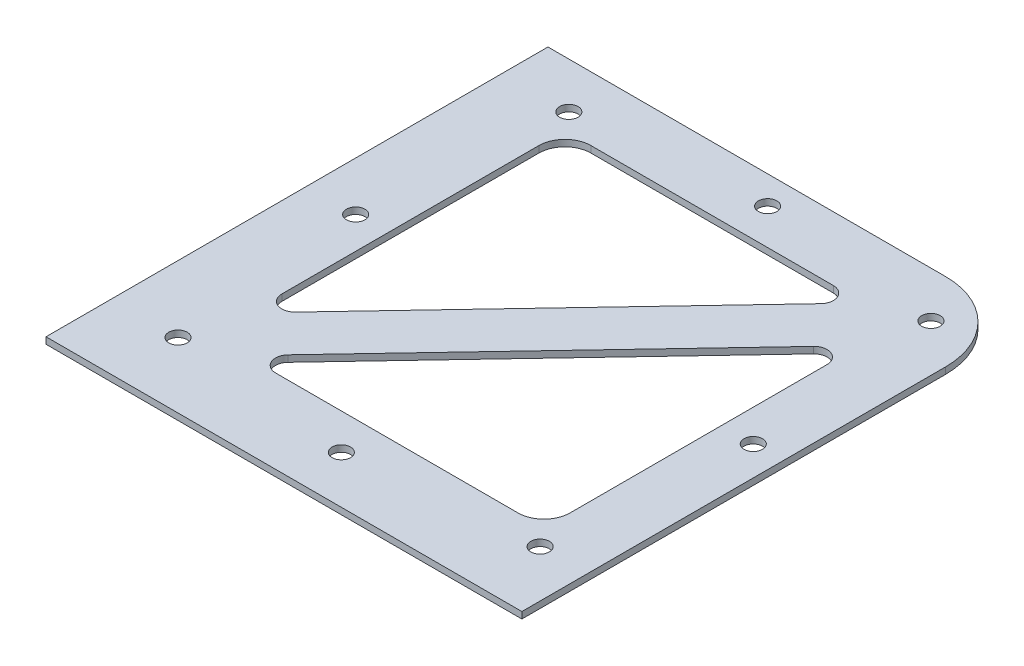
ISO-10303-21;
HEADER;
FILE_DESCRIPTION(('STEP AP214'),'2;1');
FILE_NAME('part.step','',(''),(''),'','','');
FILE_SCHEMA(('AUTOMOTIVE_DESIGN { 1 0 10303 214 1 1 1 1 }'));
ENDSEC;
DATA;
#1=APPLICATION_CONTEXT('core data for automotive mechanical design processes');
#2=APPLICATION_PROTOCOL_DEFINITION('international standard','automotive_design',2000,#1);
#3=PRODUCT_CONTEXT('',#1,'mechanical');
#4=PRODUCT('Part','Part','',(#3));
#5=PRODUCT_RELATED_PRODUCT_CATEGORY('part','',(#4));
#6=PRODUCT_DEFINITION_FORMATION('','',#4);
#7=PRODUCT_DEFINITION_CONTEXT('part definition',#1,'design');
#8=PRODUCT_DEFINITION('design','',#6,#7);
#9=PRODUCT_DEFINITION_SHAPE('','',#8);
#10=(LENGTH_UNIT() NAMED_UNIT(*) SI_UNIT(.MILLI.,.METRE.));
#11=(NAMED_UNIT(*) PLANE_ANGLE_UNIT() SI_UNIT($,.RADIAN.));
#12=(NAMED_UNIT(*) SI_UNIT($,.STERADIAN.) SOLID_ANGLE_UNIT());
#13=UNCERTAINTY_MEASURE_WITH_UNIT(LENGTH_MEASURE(1.E-05),#10,'distance_accuracy_value','');
#14=(GEOMETRIC_REPRESENTATION_CONTEXT(3) GLOBAL_UNCERTAINTY_ASSIGNED_CONTEXT((#13)) GLOBAL_UNIT_ASSIGNED_CONTEXT((#10,
#11,#12)) REPRESENTATION_CONTEXT('',''));
#15=CARTESIAN_POINT('',(0.,0.,0.));
#16=DIRECTION('',(0.,0.,1.));
#17=DIRECTION('',(1.,0.,0.));
#18=AXIS2_PLACEMENT_3D('',#15,#16,#17);
#19=CARTESIAN_POINT('',(-37.4939982606286,1.5875,0.));
#20=DIRECTION('',(1.,0.,0.));
#21=DIRECTION('',(0.,0.,-1.));
#22=AXIS2_PLACEMENT_3D('',#19,#20,#21);
#23=PLANE('',#22);
#24=DIRECTION('',(0.,0.,1.));
#25=VECTOR('',#24,1.);
#26=CARTESIAN_POINT('',(-37.4939982606286,0.,0.));
#27=LINE('',#26,#25);
#28=CARTESIAN_POINT('',(-37.4939982606286,0.,-156.662710111557));
#29=VERTEX_POINT('',#28);
#30=CARTESIAN_POINT('',(-37.4939982606286,0.,-53.4752101115565));
#31=VERTEX_POINT('',#30);
#32=EDGE_CURVE('E211',#29,#31,#27,.T.);
#33=ORIENTED_EDGE('',*,*,#32,.F.);
#34=DIRECTION('',(0.,-1.,0.));
#35=VECTOR('',#34,1.);
#36=CARTESIAN_POINT('',(-37.4939982606286,1.5875,-156.662710111557));
#37=LINE('',#36,#35);
#38=CARTESIAN_POINT('',(-37.4939982606286,1.5875,-156.662710111557));
#39=VERTEX_POINT('',#38);
#40=EDGE_CURVE('E226',#29,#39,#37,.F.);
#41=ORIENTED_EDGE('',*,*,#40,.T.);
#42=DIRECTION('',(0.,0.,1.));
#43=VECTOR('',#42,1.);
#44=CARTESIAN_POINT('',(-37.4939982606286,1.5875,0.));
#45=LINE('',#44,#43);
#46=CARTESIAN_POINT('',(-37.4939982606286,1.5875,-53.4752101115565));
#47=VERTEX_POINT('',#46);
#48=EDGE_CURVE('E188',#39,#47,#45,.T.);
#49=ORIENTED_EDGE('',*,*,#48,.T.);
#50=DIRECTION('',(0.,-1.,0.));
#51=VECTOR('',#50,1.);
#52=CARTESIAN_POINT('',(-37.4939982606286,1.5875,-53.4752101115565));
#53=LINE('',#52,#51);
#54=EDGE_CURVE('E195',#47,#31,#53,.T.);
#55=ORIENTED_EDGE('',*,*,#54,.T.);
#56=EDGE_LOOP('',(#33,#41,#49,#55));
#57=FACE_BOUND('',#56,.T.);
#58=ADVANCED_FACE('F41',(#57),#23,.T.);
#59=CARTESIAN_POINT('',(0.,1.5875,-175.712710111557));
#60=DIRECTION('',(0.,0.,-1.));
#61=DIRECTION('',(-1.,0.,0.));
#62=AXIS2_PLACEMENT_3D('',#59,#60,#61);
#63=PLANE('',#62);
#64=DIRECTION('',(1.,0.,0.));
#65=VECTOR('',#64,1.);
#66=CARTESIAN_POINT('',(0.,1.5875,-175.712710111557));
#67=LINE('',#66,#65);
#68=CARTESIAN_POINT('',(-153.381498260629,1.5875,-175.712710111557));
#69=VERTEX_POINT('',#68);
#70=CARTESIAN_POINT('',(-56.5439982606286,1.5875,-175.712710111557));
#71=VERTEX_POINT('',#70);
#72=EDGE_CURVE('E165',#69,#71,#67,.T.);
#73=ORIENTED_EDGE('',*,*,#72,.T.);
#74=DIRECTION('',(0.,-1.,0.));
#75=VECTOR('',#74,1.);
#76=CARTESIAN_POINT('',(-56.5439982606286,1.5875,-175.712710111557));
#77=LINE('',#76,#75);
#78=CARTESIAN_POINT('',(-56.5439982606286,0.,-175.712710111557));
#79=VERTEX_POINT('',#78);
#80=EDGE_CURVE('E172',#71,#79,#77,.T.);
#81=ORIENTED_EDGE('',*,*,#80,.T.);
#82=DIRECTION('',(1.,0.,0.));
#83=VECTOR('',#82,1.);
#84=CARTESIAN_POINT('',(0.,0.,-175.712710111557));
#85=LINE('',#84,#83);
#86=CARTESIAN_POINT('',(-153.381498260629,0.,-175.712710111557));
#87=VERTEX_POINT('',#86);
#88=EDGE_CURVE('E168',#87,#79,#85,.T.);
#89=ORIENTED_EDGE('',*,*,#88,.F.);
#90=DIRECTION('',(0.,-1.,0.));
#91=VECTOR('',#90,1.);
#92=CARTESIAN_POINT('',(-153.381498260629,1.5875,-175.712710111557));
#93=LINE('',#92,#91);
#94=EDGE_CURVE('E160',#69,#87,#93,.T.);
#95=ORIENTED_EDGE('',*,*,#94,.F.);
#96=EDGE_LOOP('',(#73,#81,#89,#95));
#97=FACE_BOUND('',#96,.T.);
#98=ADVANCED_FACE('F162',(#97),#63,.T.);
#99=CARTESIAN_POINT('',(-153.381498260629,1.5875,0.));
#100=DIRECTION('',(1.,0.,0.));
#101=DIRECTION('',(0.,0.,-1.));
#102=AXIS2_PLACEMENT_3D('',#99,#100,#101);
#103=PLANE('',#102);
#104=DIRECTION('',(0.,0.,1.));
#105=VECTOR('',#104,1.);
#106=CARTESIAN_POINT('',(-153.381498260629,0.,0.));
#107=LINE('',#106,#105);
#108=CARTESIAN_POINT('',(-153.381498260629,0.,-53.4752101115565));
#109=VERTEX_POINT('',#108);
#110=EDGE_CURVE('E214',#87,#109,#107,.T.);
#111=ORIENTED_EDGE('',*,*,#110,.T.);
#112=DIRECTION('',(0.,-1.,0.));
#113=VECTOR('',#112,1.);
#114=CARTESIAN_POINT('',(-153.381498260629,1.5875,-53.4752101115565));
#115=LINE('',#114,#113);
#116=CARTESIAN_POINT('',(-153.381498260629,1.5875,-53.4752101115565));
#117=VERTEX_POINT('',#116);
#118=EDGE_CURVE('E173',#117,#109,#115,.T.);
#119=ORIENTED_EDGE('',*,*,#118,.F.);
#120=DIRECTION('',(0.,0.,1.));
#121=VECTOR('',#120,1.);
#122=CARTESIAN_POINT('',(-153.381498260629,1.5875,0.));
#123=LINE('',#122,#121);
#124=EDGE_CURVE('E177',#69,#117,#123,.T.);
#125=ORIENTED_EDGE('',*,*,#124,.F.);
#126=ORIENTED_EDGE('',*,*,#94,.T.);
#127=EDGE_LOOP('',(#111,#119,#125,#126));
#128=FACE_BOUND('',#127,.T.);
#129=ADVANCED_FACE('F178',(#128),#103,.F.);
#130=CARTESIAN_POINT('',(0.,1.5875,-160.155210111557));
#131=DIRECTION('',(0.,0.,-1.));
#132=DIRECTION('',(-1.,0.,0.));
#133=AXIS2_PLACEMENT_3D('',#130,#131,#132);
#134=PLANE('',#133);
#135=DIRECTION('',(1.,0.,0.));
#136=VECTOR('',#135,1.);
#137=CARTESIAN_POINT('',(0.,0.,-160.155210111557));
#138=LINE('',#137,#136);
#139=CARTESIAN_POINT('',(-127.346498260629,0.,-160.155210111557));
#140=VERTEX_POINT('',#139);
#141=CARTESIAN_POINT('',(-68.3253059128234,0.,-160.155210111557));
#142=VERTEX_POINT('',#141);
#143=EDGE_CURVE('E204',#140,#142,#138,.T.);
#144=ORIENTED_EDGE('',*,*,#143,.T.);
#145=DIRECTION('',(0.,-1.,0.));
#146=VECTOR('',#145,1.);
#147=CARTESIAN_POINT('',(-68.3253059128234,1.5875,-160.155210111557));
#148=LINE('',#147,#146);
#149=CARTESIAN_POINT('',(-68.3253059128234,1.5875,-160.155210111557));
#150=VERTEX_POINT('',#149);
#151=EDGE_CURVE('E62',#142,#150,#148,.F.);
#152=ORIENTED_EDGE('',*,*,#151,.T.);
#153=DIRECTION('',(1.,0.,0.));
#154=VECTOR('',#153,1.);
#155=CARTESIAN_POINT('',(0.,1.5875,-160.155210111557));
#156=LINE('',#155,#154);
#157=CARTESIAN_POINT('',(-127.346498260629,1.5875,-160.155210111557));
#158=VERTEX_POINT('',#157);
#159=EDGE_CURVE('E304',#158,#150,#156,.T.);
#160=ORIENTED_EDGE('',*,*,#159,.F.);
#161=DIRECTION('',(0.,-1.,0.));
#162=VECTOR('',#161,1.);
#163=CARTESIAN_POINT('',(-127.346498260629,1.5875,-160.155210111557));
#164=LINE('',#163,#162);
#165=EDGE_CURVE('E235',#158,#140,#164,.T.);
#166=ORIENTED_EDGE('',*,*,#165,.T.);
#167=EDGE_LOOP('',(#144,#152,#160,#166));
#168=FACE_BOUND('',#167,.T.);
#169=ADVANCED_FACE('F434',(#168),#134,.F.);
#170=CARTESIAN_POINT('',(-112.12164931785,1.5875,-106.061019624993));
#171=DIRECTION('',(-0.726468416954716,0.,-0.687199853876083));
#172=DIRECTION('',(-0.687199853876083,0.,0.726468416954716));
#173=AXIS2_PLACEMENT_3D('',#170,#171,#172);
#174=PLANE('',#173);
#175=DIRECTION('',(0.687199853876083,0.,-0.726468416954716));
#176=VECTOR('',#175,1.);
#177=CARTESIAN_POINT('',(-112.12164931785,0.,-106.061019624993));
#178=LINE('',#177,#176);
#179=CARTESIAN_POINT('',(-128.214961036797,0.,-89.0480900935344));
#180=VERTEX_POINT('',#179);
#181=CARTESIAN_POINT('',(-66.0187686889921,0.,-154.7983505755));
#182=VERTEX_POINT('',#181);
#183=EDGE_CURVE('E206',#180,#182,#178,.T.);
#184=ORIENTED_EDGE('',*,*,#183,.F.);
#185=DIRECTION('',(0.,-1.,0.));
#186=VECTOR('',#185,1.);
#187=CARTESIAN_POINT('',(-128.214961036797,1.5875,-89.0480900935344));
#188=LINE('',#187,#186);
#189=CARTESIAN_POINT('',(-128.214961036797,1.5875,-89.0480900935344));
#190=VERTEX_POINT('',#189);
#191=EDGE_CURVE('E266',#180,#190,#188,.F.);
#192=ORIENTED_EDGE('',*,*,#191,.T.);
#193=DIRECTION('',(0.687199853876083,0.,-0.726468416954716));
#194=VECTOR('',#193,1.);
#195=CARTESIAN_POINT('',(-112.12164931785,1.5875,-106.061019624993));
#196=LINE('',#195,#194);
#197=CARTESIAN_POINT('',(-66.0187686889921,1.5875,-154.7983505755));
#198=VERTEX_POINT('',#197);
#199=EDGE_CURVE('E287',#190,#198,#196,.T.);
#200=ORIENTED_EDGE('',*,*,#199,.T.);
#201=DIRECTION('',(0.,-1.,0.));
#202=VECTOR('',#201,1.);
#203=CARTESIAN_POINT('',(-66.0187686889921,1.5875,-154.7983505755));
#204=LINE('',#203,#202);
#205=EDGE_CURVE('E263',#198,#182,#204,.T.);
#206=ORIENTED_EDGE('',*,*,#205,.T.);
#207=EDGE_LOOP('',(#184,#192,#200,#206));
#208=FACE_BOUND('',#207,.T.);
#209=ADVANCED_FACE('F300',(#208),#174,.T.);
#210=CARTESIAN_POINT('',(-102.895500422525,1.5875,-97.3335814807669));
#211=DIRECTION('',(-0.726468416954716,0.,-0.687199853876083));
#212=DIRECTION('',(-0.687199853876083,0.,0.726468416954716));
#213=AXIS2_PLACEMENT_3D('',#210,#211,#212);
#214=PLANE('',#213);
#215=DIRECTION('',(0.687199853876083,0.,-0.726468416954716));
#216=VECTOR('',#215,1.);
#217=CARTESIAN_POINT('',(-102.895500422525,0.,-97.3335814807669));
#218=LINE('',#217,#216);
#219=CARTESIAN_POINT('',(-120.094227832265,0.,-79.1520696476131));
#220=VERTEX_POINT('',#219);
#221=CARTESIAN_POINT('',(-57.8980354844598,0.,-144.902330129579));
#222=VERTEX_POINT('',#221);
#223=EDGE_CURVE('E196',#220,#222,#218,.T.);
#224=ORIENTED_EDGE('',*,*,#223,.T.);
#225=DIRECTION('',(0.,-1.,0.));
#226=VECTOR('',#225,1.);
#227=CARTESIAN_POINT('',(-57.8980354844598,1.5875,-144.902330129579));
#228=LINE('',#227,#226);
#229=CARTESIAN_POINT('',(-57.8980354844598,1.5875,-144.902330129579));
#230=VERTEX_POINT('',#229);
#231=EDGE_CURVE('E256',#222,#230,#228,.F.);
#232=ORIENTED_EDGE('',*,*,#231,.T.);
#233=DIRECTION('',(0.687199853876083,0.,-0.726468416954716));
#234=VECTOR('',#233,1.);
#235=CARTESIAN_POINT('',(-102.895500422525,1.5875,-97.3335814807669));
#236=LINE('',#235,#234);
#237=CARTESIAN_POINT('',(-120.094227832265,1.5875,-79.1520696476131));
#238=VERTEX_POINT('',#237);
#239=EDGE_CURVE('E219',#238,#230,#236,.T.);
#240=ORIENTED_EDGE('',*,*,#239,.F.);
#241=DIRECTION('',(0.,-1.,0.));
#242=VECTOR('',#241,1.);
#243=CARTESIAN_POINT('',(-120.094227832265,1.5875,-79.1520696476131));
#244=LINE('',#243,#242);
#245=EDGE_CURVE('E253',#238,#220,#244,.T.);
#246=ORIENTED_EDGE('',*,*,#245,.T.);
#247=EDGE_LOOP('',(#224,#232,#240,#246));
#248=FACE_BOUND('',#247,.T.);
#249=ADVANCED_FACE('F395',(#248),#214,.F.);
#250=CARTESIAN_POINT('',(-52.4164982606285,1.5875,0.));
#251=DIRECTION('',(1.,0.,0.));
#252=DIRECTION('',(0.,0.,-1.));
#253=AXIS2_PLACEMENT_3D('',#250,#251,#252);
#254=PLANE('',#253);
#255=DIRECTION('',(0.,0.,1.));
#256=VECTOR('',#255,1.);
#257=CARTESIAN_POINT('',(-52.4164982606285,1.5875,0.));
#258=LINE('',#257,#256);
#259=CARTESIAN_POINT('',(-52.4164982606286,1.5875,-142.720470593522));
#260=VERTEX_POINT('',#259);
#261=CARTESIAN_POINT('',(-52.4164982606286,1.5875,-80.1452101115566));
#262=VERTEX_POINT('',#261);
#263=EDGE_CURVE('E309',#260,#262,#258,.T.);
#264=ORIENTED_EDGE('',*,*,#263,.F.);
#265=DIRECTION('',(0.,-1.,0.));
#266=VECTOR('',#265,1.);
#267=CARTESIAN_POINT('',(-52.4164982606286,0.,-142.720470593522));
#268=LINE('',#267,#266);
#269=CARTESIAN_POINT('',(-52.4164982606286,0.,-142.720470593522));
#270=VERTEX_POINT('',#269);
#271=EDGE_CURVE('E250',#260,#270,#268,.T.);
#272=ORIENTED_EDGE('',*,*,#271,.T.);
#273=DIRECTION('',(0.,0.,1.));
#274=VECTOR('',#273,1.);
#275=CARTESIAN_POINT('',(-52.4164982606285,0.,0.));
#276=LINE('',#275,#274);
#277=CARTESIAN_POINT('',(-52.4164982606286,0.,-80.1452101115566));
#278=VERTEX_POINT('',#277);
#279=EDGE_CURVE('E199',#270,#278,#276,.T.);
#280=ORIENTED_EDGE('',*,*,#279,.T.);
#281=DIRECTION('',(0.,-1.,0.));
#282=VECTOR('',#281,1.);
#283=CARTESIAN_POINT('',(-52.4164982606286,1.5875,-80.1452101115566));
#284=LINE('',#283,#282);
#285=EDGE_CURVE('E232',#278,#262,#284,.F.);
#286=ORIENTED_EDGE('',*,*,#285,.T.);
#287=EDGE_LOOP('',(#264,#272,#280,#286));
#288=FACE_BOUND('',#287,.T.);
#289=ADVANCED_FACE('F406',(#288),#254,.F.);
#290=CARTESIAN_POINT('',(-133.696498260629,1.5875,0.));
#291=DIRECTION('',(1.,0.,0.));
#292=DIRECTION('',(0.,0.,-1.));
#293=AXIS2_PLACEMENT_3D('',#290,#291,#292);
#294=PLANE('',#293);
#295=DIRECTION('',(0.,0.,1.));
#296=VECTOR('',#295,1.);
#297=CARTESIAN_POINT('',(-133.696498260629,1.5875,0.));
#298=LINE('',#297,#296);
#299=CARTESIAN_POINT('',(-133.696498260629,1.5875,-153.805210111557));
#300=VERTEX_POINT('',#299);
#301=CARTESIAN_POINT('',(-133.696498260629,1.5875,-91.229949629591));
#302=VERTEX_POINT('',#301);
#303=EDGE_CURVE('E190',#300,#302,#298,.T.);
#304=ORIENTED_EDGE('',*,*,#303,.T.);
#305=DIRECTION('',(0.,-1.,0.));
#306=VECTOR('',#305,1.);
#307=CARTESIAN_POINT('',(-133.696498260629,0.,-91.229949629591));
#308=LINE('',#307,#306);
#309=CARTESIAN_POINT('',(-133.696498260629,0.,-91.229949629591));
#310=VERTEX_POINT('',#309);
#311=EDGE_CURVE('E260',#302,#310,#308,.T.);
#312=ORIENTED_EDGE('',*,*,#311,.T.);
#313=DIRECTION('',(0.,0.,1.));
#314=VECTOR('',#313,1.);
#315=CARTESIAN_POINT('',(-133.696498260629,0.,0.));
#316=LINE('',#315,#314);
#317=CARTESIAN_POINT('',(-133.696498260629,0.,-153.805210111557));
#318=VERTEX_POINT('',#317);
#319=EDGE_CURVE('E208',#318,#310,#316,.T.);
#320=ORIENTED_EDGE('',*,*,#319,.F.);
#321=DIRECTION('',(0.,-1.,0.));
#322=VECTOR('',#321,1.);
#323=CARTESIAN_POINT('',(-133.696498260629,1.5875,-153.805210111557));
#324=LINE('',#323,#322);
#325=EDGE_CURVE('E238',#318,#300,#324,.F.);
#326=ORIENTED_EDGE('',*,*,#325,.T.);
#327=EDGE_LOOP('',(#304,#312,#320,#326));
#328=FACE_BOUND('',#327,.T.);
#329=ADVANCED_FACE('F292',(#328),#294,.T.);
#330=CARTESIAN_POINT('',(0.,1.5875,-73.7952101115566));
#331=DIRECTION('',(0.,0.,-1.));
#332=DIRECTION('',(-1.,0.,0.));
#333=AXIS2_PLACEMENT_3D('',#330,#331,#332);
#334=PLANE('',#333);
#335=DIRECTION('',(1.,0.,0.));
#336=VECTOR('',#335,1.);
#337=CARTESIAN_POINT('',(0.,0.,-73.7952101115566));
#338=LINE('',#337,#336);
#339=CARTESIAN_POINT('',(-117.787690608434,0.,-73.7952101115566));
#340=VERTEX_POINT('',#339);
#341=CARTESIAN_POINT('',(-58.7664982606286,0.,-73.7952101115566));
#342=VERTEX_POINT('',#341);
#343=EDGE_CURVE('E202',#340,#342,#338,.T.);
#344=ORIENTED_EDGE('',*,*,#343,.F.);
#345=DIRECTION('',(0.,-1.,0.));
#346=VECTOR('',#345,1.);
#347=CARTESIAN_POINT('',(-117.787690608434,1.5875,-73.7952101115566));
#348=LINE('',#347,#346);
#349=CARTESIAN_POINT('',(-117.787690608434,1.5875,-73.7952101115566));
#350=VERTEX_POINT('',#349);
#351=EDGE_CURVE('E258',#340,#350,#348,.F.);
#352=ORIENTED_EDGE('',*,*,#351,.T.);
#353=DIRECTION('',(1.,0.,0.));
#354=VECTOR('',#353,1.);
#355=CARTESIAN_POINT('',(0.,1.5875,-73.7952101115566));
#356=LINE('',#355,#354);
#357=CARTESIAN_POINT('',(-58.7664982606286,1.5875,-73.7952101115566));
#358=VERTEX_POINT('',#357);
#359=EDGE_CURVE('E306',#350,#358,#356,.T.);
#360=ORIENTED_EDGE('',*,*,#359,.T.);
#361=DIRECTION('',(0.,-1.,0.));
#362=VECTOR('',#361,1.);
#363=CARTESIAN_POINT('',(-58.7664982606286,1.5875,-73.7952101115566));
#364=LINE('',#363,#362);
#365=EDGE_CURVE('E229',#358,#342,#364,.T.);
#366=ORIENTED_EDGE('',*,*,#365,.T.);
#367=EDGE_LOOP('',(#344,#352,#360,#366));
#368=FACE_BOUND('',#367,.T.);
#369=ADVANCED_FACE('F411',(#368),#334,.T.);
#370=CARTESIAN_POINT('',(0.,1.5875,-53.4752101115565));
#371=DIRECTION('',(0.,0.,-1.));
#372=DIRECTION('',(-1.,0.,0.));
#373=AXIS2_PLACEMENT_3D('',#370,#371,#372);
#374=PLANE('',#373);
#375=DIRECTION('',(1.,0.,0.));
#376=VECTOR('',#375,1.);
#377=CARTESIAN_POINT('',(0.,0.,-53.4752101115565));
#378=LINE('',#377,#376);
#379=EDGE_CURVE('E216',#109,#31,#378,.T.);
#380=ORIENTED_EDGE('',*,*,#379,.T.);
#381=ORIENTED_EDGE('',*,*,#54,.F.);
#382=DIRECTION('',(1.,0.,0.));
#383=VECTOR('',#382,1.);
#384=CARTESIAN_POINT('',(0.,1.5875,-53.4752101115565));
#385=LINE('',#384,#383);
#386=EDGE_CURVE('E182',#117,#47,#385,.T.);
#387=ORIENTED_EDGE('',*,*,#386,.F.);
#388=ORIENTED_EDGE('',*,*,#118,.T.);
#389=EDGE_LOOP('',(#380,#381,#387,#388));
#390=FACE_BOUND('',#389,.T.);
#391=ADVANCED_FACE('F367',(#390),#374,.F.);
#392=CARTESIAN_POINT('',(0.,1.5875,0.));
#393=DIRECTION('',(0.,1.,0.));
#394=DIRECTION('',(0.,0.,1.));
#395=AXIS2_PLACEMENT_3D('',#392,#393,#394);
#396=PLANE('',#395);
#397=CARTESIAN_POINT('',(-93.0564982612727,1.5875,-65.0655101115565));
#398=DIRECTION('',(0.,1.,0.));
#399=DIRECTION('',(0.,0.,1.));
#400=AXIS2_PLACEMENT_3D('',#397,#398,#399);
#401=CIRCLE('',#400,2.24999999999999);
#402=CARTESIAN_POINT('',(-93.0564982612727,1.5875,-62.8155101115566));
#403=VERTEX_POINT('',#402);
#404=EDGE_CURVE('E359',#403,#403,#401,.T.);
#405=ORIENTED_EDGE('',*,*,#404,.F.);
#406=EDGE_LOOP('',(#405));
#407=FACE_BOUND('',#406,.T.);
#408=CARTESIAN_POINT('',(-137.147868510237,1.5875,-69.3838398701059));
#409=DIRECTION('',(0.,1.,0.));
#410=DIRECTION('',(0.,0.,1.));
#411=AXIS2_PLACEMENT_3D('',#408,#409,#410);
#412=CIRCLE('',#411,2.25);
#413=CARTESIAN_POINT('',(-137.147868510237,1.5875,-67.1338398701059));
#414=VERTEX_POINT('',#413);
#415=EDGE_CURVE('E353',#414,#414,#412,.T.);
#416=ORIENTED_EDGE('',*,*,#415,.F.);
#417=EDGE_LOOP('',(#416));
#418=FACE_BOUND('',#417,.T.);
#419=CARTESIAN_POINT('',(-141.466198251466,1.5875,-116.975210120702));
#420=DIRECTION('',(0.,1.,0.));
#421=DIRECTION('',(0.,0.,1.));
#422=AXIS2_PLACEMENT_3D('',#419,#420,#421);
#423=CIRCLE('',#422,2.24999999999997);
#424=CARTESIAN_POINT('',(-141.466198251466,1.5875,-114.725210120702));
#425=VERTEX_POINT('',#424);
#426=EDGE_CURVE('E347',#425,#425,#423,.T.);
#427=ORIENTED_EDGE('',*,*,#426,.F.);
#428=EDGE_LOOP('',(#427));
#429=FACE_BOUND('',#428,.T.);
#430=CARTESIAN_POINT('',(-137.147868492256,1.5875,-164.566580369666));
#431=DIRECTION('',(0.,1.,0.));
#432=DIRECTION('',(0.,0.,1.));
#433=AXIS2_PLACEMENT_3D('',#430,#431,#432);
#434=CIRCLE('',#433,2.24999999999997);
#435=CARTESIAN_POINT('',(-137.147868492256,1.5875,-162.316580369666));
#436=VERTEX_POINT('',#435);
#437=EDGE_CURVE('E341',#436,#436,#434,.T.);
#438=ORIENTED_EDGE('',*,*,#437,.F.);
#439=EDGE_LOOP('',(#438));
#440=FACE_BOUND('',#439,.T.);
#441=CARTESIAN_POINT('',(-93.0564982416597,1.5875,-168.884910111557));
#442=DIRECTION('',(0.,1.,0.));
#443=DIRECTION('',(0.,0.,1.));
#444=AXIS2_PLACEMENT_3D('',#441,#442,#443);
#445=CIRCLE('',#444,2.24999999999999);
#446=CARTESIAN_POINT('',(-93.0564982416597,1.5875,-166.634910111557));
#447=VERTEX_POINT('',#446);
#448=EDGE_CURVE('E335',#447,#447,#445,.T.);
#449=ORIENTED_EDGE('',*,*,#448,.F.);
#450=EDGE_LOOP('',(#449));
#451=FACE_BOUND('',#450,.T.);
#452=CARTESIAN_POINT('',(-48.9651279926954,1.5875,-164.566580353007));
#453=DIRECTION('',(0.,1.,0.));
#454=DIRECTION('',(0.,0.,1.));
#455=AXIS2_PLACEMENT_3D('',#452,#453,#454);
#456=CIRCLE('',#455,2.24999999999999);
#457=CARTESIAN_POINT('',(-48.9651279926954,1.5875,-162.316580353007));
#458=VERTEX_POINT('',#457);
#459=EDGE_CURVE('E329',#458,#458,#456,.T.);
#460=ORIENTED_EDGE('',*,*,#459,.F.);
#461=EDGE_LOOP('',(#460));
#462=FACE_BOUND('',#461,.T.);
#463=CARTESIAN_POINT('',(-44.6467982514662,1.5875,-116.975210102411));
#464=DIRECTION('',(0.,1.,0.));
#465=DIRECTION('',(0.,0.,1.));
#466=AXIS2_PLACEMENT_3D('',#463,#464,#465);
#467=CIRCLE('',#466,2.24999999999999);
#468=CARTESIAN_POINT('',(-44.6467982514662,1.5875,-114.725210102411));
#469=VERTEX_POINT('',#468);
#470=EDGE_CURVE('E323',#469,#469,#467,.T.);
#471=ORIENTED_EDGE('',*,*,#470,.F.);
#472=EDGE_LOOP('',(#471));
#473=FACE_BOUND('',#472,.T.);
#474=CARTESIAN_POINT('',(-48.9651280106769,1.5875,-69.3838398534469));
#475=DIRECTION('',(0.,1.,0.));
#476=DIRECTION('',(0.,0.,1.));
#477=AXIS2_PLACEMENT_3D('',#474,#475,#476);
#478=CIRCLE('',#477,2.24999999999999);
#479=CARTESIAN_POINT('',(-48.9651280106769,1.5875,-67.1338398534469));
#480=VERTEX_POINT('',#479);
#481=EDGE_CURVE('E317',#480,#480,#478,.T.);
#482=ORIENTED_EDGE('',*,*,#481,.F.);
#483=EDGE_LOOP('',(#482));
#484=FACE_BOUND('',#483,.T.);
#485=ORIENTED_EDGE('',*,*,#359,.F.);
#486=CARTESIAN_POINT('',(-117.787690608434,1.5875,-76.9702101115566));
#487=DIRECTION('',(0.,1.,0.));
#488=DIRECTION('',(0.,0.,1.));
#489=AXIS2_PLACEMENT_3D('',#486,#487,#488);
#490=CIRCLE('',#489,3.175);
#491=EDGE_CURVE('E275',#350,#238,#490,.F.);
#492=ORIENTED_EDGE('',*,*,#491,.T.);
#493=ORIENTED_EDGE('',*,*,#239,.T.);
#494=CARTESIAN_POINT('',(-55.5914982606286,1.5875,-142.720470593522));
#495=DIRECTION('',(0.,1.,0.));
#496=DIRECTION('',(0.,0.,1.));
#497=AXIS2_PLACEMENT_3D('',#494,#495,#496);
#498=CIRCLE('',#497,3.175);
#499=EDGE_CURVE('E271',#230,#260,#498,.F.);
#500=ORIENTED_EDGE('',*,*,#499,.T.);
#501=ORIENTED_EDGE('',*,*,#263,.T.);
#502=CARTESIAN_POINT('',(-58.7664982606286,1.5875,-80.1452101115566));
#503=DIRECTION('',(0.,1.,0.));
#504=DIRECTION('',(0.,0.,1.));
#505=AXIS2_PLACEMENT_3D('',#502,#503,#504);
#506=CIRCLE('',#505,6.35);
#507=EDGE_CURVE('E243',#262,#358,#506,.F.);
#508=ORIENTED_EDGE('',*,*,#507,.T.);
#509=EDGE_LOOP('',(#485,#492,#493,#500,#501,#508));
#510=FACE_BOUND('',#509,.T.);
#511=ORIENTED_EDGE('',*,*,#303,.F.);
#512=CARTESIAN_POINT('',(-127.346498260629,1.5875,-153.805210111557));
#513=DIRECTION('',(0.,1.,0.));
#514=DIRECTION('',(0.,0.,1.));
#515=AXIS2_PLACEMENT_3D('',#512,#513,#514);
#516=CIRCLE('',#515,6.35);
#517=EDGE_CURVE('E248',#300,#158,#516,.F.);
#518=ORIENTED_EDGE('',*,*,#517,.T.);
#519=ORIENTED_EDGE('',*,*,#159,.T.);
#520=CARTESIAN_POINT('',(-68.3253059128234,1.5875,-156.980210111557));
#521=DIRECTION('',(0.,1.,0.));
#522=DIRECTION('',(0.,0.,1.));
#523=AXIS2_PLACEMENT_3D('',#520,#521,#522);
#524=CIRCLE('',#523,3.175);
#525=EDGE_CURVE('E11',#150,#198,#524,.F.);
#526=ORIENTED_EDGE('',*,*,#525,.T.);
#527=ORIENTED_EDGE('',*,*,#199,.F.);
#528=CARTESIAN_POINT('',(-130.521498260629,1.5875,-91.229949629591));
#529=DIRECTION('',(0.,1.,0.));
#530=DIRECTION('',(0.,0.,1.));
#531=AXIS2_PLACEMENT_3D('',#528,#529,#530);
#532=CIRCLE('',#531,3.175);
#533=EDGE_CURVE('E279',#190,#302,#532,.F.);
#534=ORIENTED_EDGE('',*,*,#533,.T.);
#535=EDGE_LOOP('',(#511,#518,#519,#526,#527,#534));
#536=FACE_BOUND('',#535,.T.);
#537=ORIENTED_EDGE('',*,*,#48,.F.);
#538=CARTESIAN_POINT('',(-56.5439982606286,1.5875,-156.662710111557));
#539=DIRECTION('',(0.,1.,0.));
#540=DIRECTION('',(0.,0.,1.));
#541=AXIS2_PLACEMENT_3D('',#538,#539,#540);
#542=CIRCLE('',#541,19.05);
#543=EDGE_CURVE('E187',#39,#71,#542,.T.);
#544=ORIENTED_EDGE('',*,*,#543,.T.);
#545=ORIENTED_EDGE('',*,*,#72,.F.);
#546=ORIENTED_EDGE('',*,*,#124,.T.);
#547=ORIENTED_EDGE('',*,*,#386,.T.);
#548=EDGE_LOOP('',(#537,#544,#545,#546,#547));
#549=FACE_BOUND('',#548,.T.);
#550=ADVANCED_FACE('F185',(#407,#418,#429,#440,#451,#462,#473,#484,#510,#536,#549),#396,.T.);
#551=CARTESIAN_POINT('',(0.,0.,0.));
#552=DIRECTION('',(0.,1.,0.));
#553=DIRECTION('',(0.,0.,1.));
#554=AXIS2_PLACEMENT_3D('',#551,#552,#553);
#555=PLANE('',#554);
#556=CARTESIAN_POINT('',(-93.0564982612727,0.,-65.0655101115565));
#557=DIRECTION('',(0.,1.,0.));
#558=DIRECTION('',(0.,0.,1.));
#559=AXIS2_PLACEMENT_3D('',#556,#557,#558);
#560=CIRCLE('',#559,2.25);
#561=CARTESIAN_POINT('',(-93.0564982612727,0.,-62.8155101115565));
#562=VERTEX_POINT('',#561);
#563=EDGE_CURVE('E356',#562,#562,#560,.T.);
#564=ORIENTED_EDGE('',*,*,#563,.T.);
#565=EDGE_LOOP('',(#564));
#566=FACE_BOUND('',#565,.T.);
#567=CARTESIAN_POINT('',(-137.147868510237,0.,-69.3838398701059));
#568=DIRECTION('',(0.,1.,0.));
#569=DIRECTION('',(0.,0.,1.));
#570=AXIS2_PLACEMENT_3D('',#567,#568,#569);
#571=CIRCLE('',#570,2.25);
#572=CARTESIAN_POINT('',(-137.147868510237,0.,-67.1338398701059));
#573=VERTEX_POINT('',#572);
#574=EDGE_CURVE('E350',#573,#573,#571,.T.);
#575=ORIENTED_EDGE('',*,*,#574,.T.);
#576=EDGE_LOOP('',(#575));
#577=FACE_BOUND('',#576,.T.);
#578=CARTESIAN_POINT('',(-141.466198251466,0.,-116.975210120702));
#579=DIRECTION('',(0.,1.,0.));
#580=DIRECTION('',(0.,0.,1.));
#581=AXIS2_PLACEMENT_3D('',#578,#579,#580);
#582=CIRCLE('',#581,2.25);
#583=CARTESIAN_POINT('',(-141.466198251466,0.,-114.725210120702));
#584=VERTEX_POINT('',#583);
#585=EDGE_CURVE('E344',#584,#584,#582,.T.);
#586=ORIENTED_EDGE('',*,*,#585,.T.);
#587=EDGE_LOOP('',(#586));
#588=FACE_BOUND('',#587,.T.);
#589=CARTESIAN_POINT('',(-137.147868492256,0.,-164.566580369666));
#590=DIRECTION('',(0.,1.,0.));
#591=DIRECTION('',(0.,0.,1.));
#592=AXIS2_PLACEMENT_3D('',#589,#590,#591);
#593=CIRCLE('',#592,2.25);
#594=CARTESIAN_POINT('',(-137.147868492256,0.,-162.316580369666));
#595=VERTEX_POINT('',#594);
#596=EDGE_CURVE('E338',#595,#595,#593,.T.);
#597=ORIENTED_EDGE('',*,*,#596,.T.);
#598=EDGE_LOOP('',(#597));
#599=FACE_BOUND('',#598,.T.);
#600=CARTESIAN_POINT('',(-93.0564982416597,0.,-168.884910111557));
#601=DIRECTION('',(0.,1.,0.));
#602=DIRECTION('',(0.,0.,1.));
#603=AXIS2_PLACEMENT_3D('',#600,#601,#602);
#604=CIRCLE('',#603,2.25);
#605=CARTESIAN_POINT('',(-93.0564982416597,0.,-166.634910111557));
#606=VERTEX_POINT('',#605);
#607=EDGE_CURVE('E332',#606,#606,#604,.T.);
#608=ORIENTED_EDGE('',*,*,#607,.T.);
#609=EDGE_LOOP('',(#608));
#610=FACE_BOUND('',#609,.T.);
#611=CARTESIAN_POINT('',(-48.9651279926954,0.,-164.566580353007));
#612=DIRECTION('',(0.,1.,0.));
#613=DIRECTION('',(0.,0.,1.));
#614=AXIS2_PLACEMENT_3D('',#611,#612,#613);
#615=CIRCLE('',#614,2.25);
#616=CARTESIAN_POINT('',(-48.9651279926954,0.,-162.316580353007));
#617=VERTEX_POINT('',#616);
#618=EDGE_CURVE('E326',#617,#617,#615,.T.);
#619=ORIENTED_EDGE('',*,*,#618,.T.);
#620=EDGE_LOOP('',(#619));
#621=FACE_BOUND('',#620,.T.);
#622=CARTESIAN_POINT('',(-44.6467982514662,0.,-116.975210102411));
#623=DIRECTION('',(0.,1.,0.));
#624=DIRECTION('',(0.,0.,1.));
#625=AXIS2_PLACEMENT_3D('',#622,#623,#624);
#626=CIRCLE('',#625,2.25);
#627=CARTESIAN_POINT('',(-44.6467982514662,0.,-114.725210102411));
#628=VERTEX_POINT('',#627);
#629=EDGE_CURVE('E320',#628,#628,#626,.T.);
#630=ORIENTED_EDGE('',*,*,#629,.T.);
#631=EDGE_LOOP('',(#630));
#632=FACE_BOUND('',#631,.T.);
#633=CARTESIAN_POINT('',(-48.9651280106769,0.,-69.3838398534469));
#634=DIRECTION('',(0.,1.,0.));
#635=DIRECTION('',(0.,0.,1.));
#636=AXIS2_PLACEMENT_3D('',#633,#634,#635);
#637=CIRCLE('',#636,2.25);
#638=CARTESIAN_POINT('',(-48.9651280106769,0.,-67.1338398534469));
#639=VERTEX_POINT('',#638);
#640=EDGE_CURVE('E200',#639,#639,#637,.T.);
#641=ORIENTED_EDGE('',*,*,#640,.T.);
#642=EDGE_LOOP('',(#641));
#643=FACE_BOUND('',#642,.T.);
#644=ORIENTED_EDGE('',*,*,#223,.F.);
#645=CARTESIAN_POINT('',(-117.787690608434,0.,-76.9702101115566));
#646=DIRECTION('',(0.,1.,0.));
#647=DIRECTION('',(0.,0.,1.));
#648=AXIS2_PLACEMENT_3D('',#645,#646,#647);
#649=CIRCLE('',#648,3.175);
#650=EDGE_CURVE('E273',#220,#340,#649,.T.);
#651=ORIENTED_EDGE('',*,*,#650,.T.);
#652=ORIENTED_EDGE('',*,*,#343,.T.);
#653=CARTESIAN_POINT('',(-58.7664982606286,0.,-80.1452101115566));
#654=DIRECTION('',(0.,1.,0.));
#655=DIRECTION('',(0.,0.,1.));
#656=AXIS2_PLACEMENT_3D('',#653,#654,#655);
#657=CIRCLE('',#656,6.35);
#658=EDGE_CURVE('E240',#342,#278,#657,.T.);
#659=ORIENTED_EDGE('',*,*,#658,.T.);
#660=ORIENTED_EDGE('',*,*,#279,.F.);
#661=CARTESIAN_POINT('',(-55.5914982606286,0.,-142.720470593522));
#662=DIRECTION('',(0.,1.,0.));
#663=DIRECTION('',(0.,0.,1.));
#664=AXIS2_PLACEMENT_3D('',#661,#662,#663);
#665=CIRCLE('',#664,3.175);
#666=EDGE_CURVE('E269',#270,#222,#665,.T.);
#667=ORIENTED_EDGE('',*,*,#666,.T.);
#668=EDGE_LOOP('',(#644,#651,#652,#659,#660,#667));
#669=FACE_BOUND('',#668,.T.);
#670=ORIENTED_EDGE('',*,*,#143,.F.);
#671=CARTESIAN_POINT('',(-127.346498260629,0.,-153.805210111557));
#672=DIRECTION('',(0.,1.,0.));
#673=DIRECTION('',(0.,0.,1.));
#674=AXIS2_PLACEMENT_3D('',#671,#672,#673);
#675=CIRCLE('',#674,6.35);
#676=EDGE_CURVE('E246',#140,#318,#675,.T.);
#677=ORIENTED_EDGE('',*,*,#676,.T.);
#678=ORIENTED_EDGE('',*,*,#319,.T.);
#679=CARTESIAN_POINT('',(-130.521498260629,0.,-91.229949629591));
#680=DIRECTION('',(0.,1.,0.));
#681=DIRECTION('',(0.,0.,1.));
#682=AXIS2_PLACEMENT_3D('',#679,#680,#681);
#683=CIRCLE('',#682,3.175);
#684=EDGE_CURVE('E277',#310,#180,#683,.T.);
#685=ORIENTED_EDGE('',*,*,#684,.T.);
#686=ORIENTED_EDGE('',*,*,#183,.T.);
#687=CARTESIAN_POINT('',(-68.3253059128234,0.,-156.980210111557));
#688=DIRECTION('',(0.,1.,0.));
#689=DIRECTION('',(0.,0.,1.));
#690=AXIS2_PLACEMENT_3D('',#687,#688,#689);
#691=CIRCLE('',#690,3.175);
#692=EDGE_CURVE('E49',#182,#142,#691,.T.);
#693=ORIENTED_EDGE('',*,*,#692,.T.);
#694=EDGE_LOOP('',(#670,#677,#678,#685,#686,#693));
#695=FACE_BOUND('',#694,.T.);
#696=ORIENTED_EDGE('',*,*,#88,.T.);
#697=CARTESIAN_POINT('',(-56.5439982606286,0.,-156.662710111557));
#698=DIRECTION('',(0.,1.,0.));
#699=DIRECTION('',(0.,0.,1.));
#700=AXIS2_PLACEMENT_3D('',#697,#698,#699);
#701=CIRCLE('',#700,19.05);
#702=EDGE_CURVE('E224',#79,#29,#701,.F.);
#703=ORIENTED_EDGE('',*,*,#702,.T.);
#704=ORIENTED_EDGE('',*,*,#32,.T.);
#705=ORIENTED_EDGE('',*,*,#379,.F.);
#706=ORIENTED_EDGE('',*,*,#110,.F.);
#707=EDGE_LOOP('',(#696,#703,#704,#705,#706));
#708=FACE_BOUND('',#707,.T.);
#709=ADVANCED_FACE('F297',(#566,#577,#588,#599,#610,#621,#632,#643,#669,#695,#708),#555,.F.);
#710=CARTESIAN_POINT('',(-48.9651280106769,1.5875,-69.3838398534469));
#711=DIRECTION('',(0.,1.,0.));
#712=DIRECTION('',(0.,0.,1.));
#713=AXIS2_PLACEMENT_3D('',#710,#711,#712);
#714=CYLINDRICAL_SURFACE('',#713,2.25);
#715=ORIENTED_EDGE('',*,*,#640,.F.);
#716=EDGE_LOOP('',(#715));
#717=FACE_BOUND('',#716,.T.);
#718=ORIENTED_EDGE('',*,*,#481,.T.);
#719=EDGE_LOOP('',(#718));
#720=FACE_BOUND('',#719,.T.);
#721=ADVANCED_FACE('F485',(#717,#720),#714,.F.);
#722=CARTESIAN_POINT('',(-44.6467982514662,1.5875,-116.975210102411));
#723=DIRECTION('',(0.,1.,0.));
#724=DIRECTION('',(0.,0.,1.));
#725=AXIS2_PLACEMENT_3D('',#722,#723,#724);
#726=CYLINDRICAL_SURFACE('',#725,2.25);
#727=ORIENTED_EDGE('',*,*,#629,.F.);
#728=EDGE_LOOP('',(#727));
#729=FACE_BOUND('',#728,.T.);
#730=ORIENTED_EDGE('',*,*,#470,.T.);
#731=EDGE_LOOP('',(#730));
#732=FACE_BOUND('',#731,.T.);
#733=ADVANCED_FACE('F623',(#729,#732),#726,.F.);
#734=CARTESIAN_POINT('',(-48.9651279926954,1.5875,-164.566580353007));
#735=DIRECTION('',(0.,1.,0.));
#736=DIRECTION('',(0.,0.,1.));
#737=AXIS2_PLACEMENT_3D('',#734,#735,#736);
#738=CYLINDRICAL_SURFACE('',#737,2.25);
#739=ORIENTED_EDGE('',*,*,#618,.F.);
#740=EDGE_LOOP('',(#739));
#741=FACE_BOUND('',#740,.T.);
#742=ORIENTED_EDGE('',*,*,#459,.T.);
#743=EDGE_LOOP('',(#742));
#744=FACE_BOUND('',#743,.T.);
#745=ADVANCED_FACE('F613',(#741,#744),#738,.F.);
#746=CARTESIAN_POINT('',(-93.0564982416597,1.5875,-168.884910111557));
#747=DIRECTION('',(0.,1.,0.));
#748=DIRECTION('',(0.,0.,1.));
#749=AXIS2_PLACEMENT_3D('',#746,#747,#748);
#750=CYLINDRICAL_SURFACE('',#749,2.25);
#751=ORIENTED_EDGE('',*,*,#607,.F.);
#752=EDGE_LOOP('',(#751));
#753=FACE_BOUND('',#752,.T.);
#754=ORIENTED_EDGE('',*,*,#448,.T.);
#755=EDGE_LOOP('',(#754));
#756=FACE_BOUND('',#755,.T.);
#757=ADVANCED_FACE('F603',(#753,#756),#750,.F.);
#758=CARTESIAN_POINT('',(-137.147868492256,1.5875,-164.566580369666));
#759=DIRECTION('',(0.,1.,0.));
#760=DIRECTION('',(0.,0.,1.));
#761=AXIS2_PLACEMENT_3D('',#758,#759,#760);
#762=CYLINDRICAL_SURFACE('',#761,2.24999999999999);
#763=ORIENTED_EDGE('',*,*,#596,.F.);
#764=EDGE_LOOP('',(#763));
#765=FACE_BOUND('',#764,.T.);
#766=ORIENTED_EDGE('',*,*,#437,.T.);
#767=EDGE_LOOP('',(#766));
#768=FACE_BOUND('',#767,.T.);
#769=ADVANCED_FACE('F593',(#765,#768),#762,.F.);
#770=CARTESIAN_POINT('',(-141.466198251466,1.5875,-116.975210120702));
#771=DIRECTION('',(0.,1.,0.));
#772=DIRECTION('',(0.,0.,1.));
#773=AXIS2_PLACEMENT_3D('',#770,#771,#772);
#774=CYLINDRICAL_SURFACE('',#773,2.24999999999999);
#775=ORIENTED_EDGE('',*,*,#585,.F.);
#776=EDGE_LOOP('',(#775));
#777=FACE_BOUND('',#776,.T.);
#778=ORIENTED_EDGE('',*,*,#426,.T.);
#779=EDGE_LOOP('',(#778));
#780=FACE_BOUND('',#779,.T.);
#781=ADVANCED_FACE('F583',(#777,#780),#774,.F.);
#782=CARTESIAN_POINT('',(-137.147868510237,1.5875,-69.3838398701059));
#783=DIRECTION('',(0.,1.,0.));
#784=DIRECTION('',(0.,0.,1.));
#785=AXIS2_PLACEMENT_3D('',#782,#783,#784);
#786=CYLINDRICAL_SURFACE('',#785,2.25);
#787=ORIENTED_EDGE('',*,*,#574,.F.);
#788=EDGE_LOOP('',(#787));
#789=FACE_BOUND('',#788,.T.);
#790=ORIENTED_EDGE('',*,*,#415,.T.);
#791=EDGE_LOOP('',(#790));
#792=FACE_BOUND('',#791,.T.);
#793=ADVANCED_FACE('F573',(#789,#792),#786,.F.);
#794=CARTESIAN_POINT('',(-93.0564982612727,1.5875,-65.0655101115565));
#795=DIRECTION('',(0.,1.,0.));
#796=DIRECTION('',(0.,0.,1.));
#797=AXIS2_PLACEMENT_3D('',#794,#795,#796);
#798=CYLINDRICAL_SURFACE('',#797,2.25);
#799=ORIENTED_EDGE('',*,*,#563,.F.);
#800=EDGE_LOOP('',(#799));
#801=FACE_BOUND('',#800,.T.);
#802=ORIENTED_EDGE('',*,*,#404,.T.);
#803=EDGE_LOOP('',(#802));
#804=FACE_BOUND('',#803,.T.);
#805=ADVANCED_FACE('F363',(#801,#804),#798,.F.);
#806=CARTESIAN_POINT('',(-56.5439982606286,1.5875,-156.662710111557));
#807=DIRECTION('',(0.,-1.,0.));
#808=DIRECTION('',(0.,0.,-1.));
#809=AXIS2_PLACEMENT_3D('',#806,#807,#808);
#810=CYLINDRICAL_SURFACE('',#809,19.05);
#811=ORIENTED_EDGE('',*,*,#543,.F.);
#812=ORIENTED_EDGE('',*,*,#40,.F.);
#813=ORIENTED_EDGE('',*,*,#702,.F.);
#814=ORIENTED_EDGE('',*,*,#80,.F.);
#815=EDGE_LOOP('',(#811,#812,#813,#814));
#816=FACE_BOUND('',#815,.T.);
#817=ADVANCED_FACE('F448',(#816),#810,.T.);
#818=CARTESIAN_POINT('',(-58.7664982606286,1.5875,-80.1452101115566));
#819=DIRECTION('',(0.,-1.,0.));
#820=DIRECTION('',(0.,0.,-1.));
#821=AXIS2_PLACEMENT_3D('',#818,#819,#820);
#822=CYLINDRICAL_SURFACE('',#821,6.35);
#823=ORIENTED_EDGE('',*,*,#507,.F.);
#824=ORIENTED_EDGE('',*,*,#285,.F.);
#825=ORIENTED_EDGE('',*,*,#658,.F.);
#826=ORIENTED_EDGE('',*,*,#365,.F.);
#827=EDGE_LOOP('',(#823,#824,#825,#826));
#828=FACE_BOUND('',#827,.T.);
#829=ADVANCED_FACE('F410',(#828),#822,.F.);
#830=CARTESIAN_POINT('',(-127.346498260629,1.5875,-153.805210111557));
#831=DIRECTION('',(0.,-1.,0.));
#832=DIRECTION('',(0.,0.,-1.));
#833=AXIS2_PLACEMENT_3D('',#830,#831,#832);
#834=CYLINDRICAL_SURFACE('',#833,6.35);
#835=ORIENTED_EDGE('',*,*,#517,.F.);
#836=ORIENTED_EDGE('',*,*,#325,.F.);
#837=ORIENTED_EDGE('',*,*,#676,.F.);
#838=ORIENTED_EDGE('',*,*,#165,.F.);
#839=EDGE_LOOP('',(#835,#836,#837,#838));
#840=FACE_BOUND('',#839,.T.);
#841=ADVANCED_FACE('F440',(#840),#834,.F.);
#842=CARTESIAN_POINT('',(-55.5914982606286,1.5875,-142.720470593522));
#843=DIRECTION('',(0.,1.,0.));
#844=DIRECTION('',(0.,0.,1.));
#845=AXIS2_PLACEMENT_3D('',#842,#843,#844);
#846=CYLINDRICAL_SURFACE('',#845,3.175);
#847=ORIENTED_EDGE('',*,*,#499,.F.);
#848=ORIENTED_EDGE('',*,*,#231,.F.);
#849=ORIENTED_EDGE('',*,*,#666,.F.);
#850=ORIENTED_EDGE('',*,*,#271,.F.);
#851=EDGE_LOOP('',(#847,#848,#849,#850));
#852=FACE_BOUND('',#851,.T.);
#853=ADVANCED_FACE('F403',(#852),#846,.F.);
#854=CARTESIAN_POINT('',(-117.787690608434,1.5875,-76.9702101115566));
#855=DIRECTION('',(0.,-1.,0.));
#856=DIRECTION('',(0.,0.,-1.));
#857=AXIS2_PLACEMENT_3D('',#854,#855,#856);
#858=CYLINDRICAL_SURFACE('',#857,3.175);
#859=ORIENTED_EDGE('',*,*,#491,.F.);
#860=ORIENTED_EDGE('',*,*,#351,.F.);
#861=ORIENTED_EDGE('',*,*,#650,.F.);
#862=ORIENTED_EDGE('',*,*,#245,.F.);
#863=EDGE_LOOP('',(#859,#860,#861,#862));
#864=FACE_BOUND('',#863,.T.);
#865=ADVANCED_FACE('F392',(#864),#858,.F.);
#866=CARTESIAN_POINT('',(-130.521498260629,1.5875,-91.229949629591));
#867=DIRECTION('',(0.,1.,0.));
#868=DIRECTION('',(0.,0.,1.));
#869=AXIS2_PLACEMENT_3D('',#866,#867,#868);
#870=CYLINDRICAL_SURFACE('',#869,3.175);
#871=ORIENTED_EDGE('',*,*,#533,.F.);
#872=ORIENTED_EDGE('',*,*,#191,.F.);
#873=ORIENTED_EDGE('',*,*,#684,.F.);
#874=ORIENTED_EDGE('',*,*,#311,.F.);
#875=EDGE_LOOP('',(#871,#872,#873,#874));
#876=FACE_BOUND('',#875,.T.);
#877=ADVANCED_FACE('F295',(#876),#870,.F.);
#878=CARTESIAN_POINT('',(-68.3253059128234,1.5875,-156.980210111557));
#879=DIRECTION('',(0.,-1.,0.));
#880=DIRECTION('',(0.,0.,-1.));
#881=AXIS2_PLACEMENT_3D('',#878,#879,#880);
#882=CYLINDRICAL_SURFACE('',#881,3.175);
#883=ORIENTED_EDGE('',*,*,#525,.F.);
#884=ORIENTED_EDGE('',*,*,#151,.F.);
#885=ORIENTED_EDGE('',*,*,#692,.F.);
#886=ORIENTED_EDGE('',*,*,#205,.F.);
#887=EDGE_LOOP('',(#883,#884,#885,#886));
#888=FACE_BOUND('',#887,.T.);
#889=ADVANCED_FACE('F43',(#888),#882,.F.);
#890=CLOSED_SHELL('',(#58,#98,#129,#169,#209,#249,#289,#329,#369,#391,#550,#709,#721,#733,#745,
#757,#769,#781,#793,#805,#817,#829,#841,#853,#865,#877,#889));
#891=MANIFOLD_SOLID_BREP('B2',#890);
#892=ADVANCED_BREP_SHAPE_REPRESENTATION('',(#18,#891),#14);
#893=SHAPE_DEFINITION_REPRESENTATION(#9,#892);
ENDSEC;
END-ISO-10303-21;
